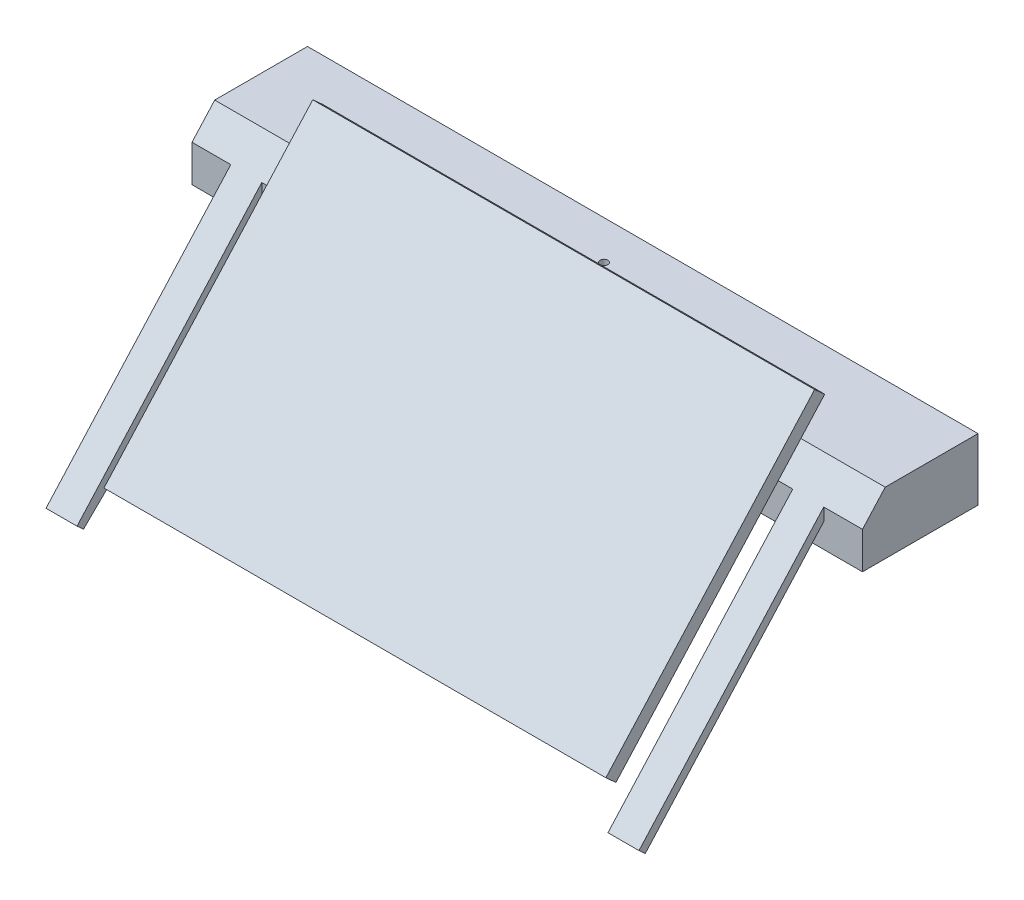
ISO-10303-21;
HEADER;
FILE_DESCRIPTION(('STEP AP214'),'2;1');
FILE_NAME('part.step','',(''),(''),'','','');
FILE_SCHEMA(('AUTOMOTIVE_DESIGN { 1 0 10303 214 1 1 1 1 }'));
ENDSEC;
DATA;
#1=APPLICATION_CONTEXT('core data for automotive mechanical design processes');
#2=APPLICATION_PROTOCOL_DEFINITION('international standard','automotive_design',2000,#1);
#3=PRODUCT_CONTEXT('',#1,'mechanical');
#4=PRODUCT('Part','Part','',(#3));
#5=PRODUCT_RELATED_PRODUCT_CATEGORY('part','',(#4));
#6=PRODUCT_DEFINITION_FORMATION('','',#4);
#7=PRODUCT_DEFINITION_CONTEXT('part definition',#1,'design');
#8=PRODUCT_DEFINITION('design','',#6,#7);
#9=PRODUCT_DEFINITION_SHAPE('','',#8);
#10=(LENGTH_UNIT() NAMED_UNIT(*) SI_UNIT(.MILLI.,.METRE.));
#11=(NAMED_UNIT(*) PLANE_ANGLE_UNIT() SI_UNIT($,.RADIAN.));
#12=(NAMED_UNIT(*) SI_UNIT($,.STERADIAN.) SOLID_ANGLE_UNIT());
#13=UNCERTAINTY_MEASURE_WITH_UNIT(LENGTH_MEASURE(1.E-05),#10,'distance_accuracy_value','');
#14=(GEOMETRIC_REPRESENTATION_CONTEXT(3) GLOBAL_UNCERTAINTY_ASSIGNED_CONTEXT((#13)) GLOBAL_UNIT_ASSIGNED_CONTEXT((#10,
#11,#12)) REPRESENTATION_CONTEXT('',''));
#15=CARTESIAN_POINT('',(0.,0.,0.));
#16=DIRECTION('',(0.,0.,1.));
#17=DIRECTION('',(1.,0.,0.));
#18=AXIS2_PLACEMENT_3D('',#15,#16,#17);
#19=CARTESIAN_POINT('',(64.75,-34.658042877744,51.4697949490209));
#20=DIRECTION('',(-1.,0.,0.));
#21=DIRECTION('',(0.,0.,1.));
#22=AXIS2_PLACEMENT_3D('',#19,#20,#21);
#23=PLANE('',#22);
#24=DIRECTION('',(0.,0.743144825477391,-0.669130606358862));
#25=VECTOR('',#24,1.);
#26=CARTESIAN_POINT('',(64.75,-37.,48.86878805985));
#27=LINE('',#26,#25);
#28=CARTESIAN_POINT('',(64.75,-37.,48.86878805985));
#29=VERTEX_POINT('',#28);
#30=CARTESIAN_POINT('',(64.75,22.82315845093,-4.99622575203842));
#31=VERTEX_POINT('',#30);
#32=EDGE_CURVE('E112',#29,#31,#27,.T.);
#33=ORIENTED_EDGE('',*,*,#32,.T.);
#34=DIRECTION('',(0.,-0.669130606358862,-0.743144825477391));
#35=VECTOR('',#34,1.);
#36=CARTESIAN_POINT('',(64.75,25.165115573186,-2.39521886286756));
#37=LINE('',#36,#35);
#38=CARTESIAN_POINT('',(64.75,25.165115573186,-2.39521886286756));
#39=VERTEX_POINT('',#38);
#40=EDGE_CURVE('E12',#39,#31,#37,.T.);
#41=ORIENTED_EDGE('',*,*,#40,.F.);
#42=DIRECTION('',(0.,0.743144825477391,-0.669130606358862));
#43=VECTOR('',#42,1.);
#44=CARTESIAN_POINT('',(64.75,-34.658042877744,51.4697949490209));
#45=LINE('',#44,#43);
#46=CARTESIAN_POINT('',(64.75,-34.658042877744,51.4697949490209));
#47=VERTEX_POINT('',#46);
#48=EDGE_CURVE('E100',#47,#39,#45,.T.);
#49=ORIENTED_EDGE('',*,*,#48,.F.);
#50=DIRECTION('',(0.,-0.669130606358862,-0.743144825477391));
#51=VECTOR('',#50,1.);
#52=CARTESIAN_POINT('',(64.75,-34.658042877744,51.4697949490209));
#53=LINE('',#52,#51);
#54=EDGE_CURVE('E108',#47,#29,#53,.T.);
#55=ORIENTED_EDGE('',*,*,#54,.T.);
#56=EDGE_LOOP('',(#33,#41,#49,#55));
#57=FACE_BOUND('',#56,.T.);
#58=ADVANCED_FACE('F49',(#57),#23,.F.);
#59=CARTESIAN_POINT('',(-64.75,25.165115573186,-2.39521886286756));
#60=DIRECTION('',(0.,-0.743144825477391,0.669130606358862));
#61=DIRECTION('',(0.,-0.669130606358862,-0.743144825477391));
#62=AXIS2_PLACEMENT_3D('',#59,#60,#61);
#63=PLANE('',#62);
#64=DIRECTION('',(-1.,0.,0.));
#65=VECTOR('',#64,1.);
#66=CARTESIAN_POINT('',(-64.75,22.82315845093,-4.99622575203842));
#67=LINE('',#66,#65);
#68=CARTESIAN_POINT('',(-64.75,22.82315845093,-4.99622575203842));
#69=VERTEX_POINT('',#68);
#70=EDGE_CURVE('E104',#31,#69,#67,.T.);
#71=ORIENTED_EDGE('',*,*,#70,.T.);
#72=DIRECTION('',(0.,-0.669130606358862,-0.743144825477391));
#73=VECTOR('',#72,1.);
#74=CARTESIAN_POINT('',(-64.75,25.165115573186,-2.39521886286756));
#75=LINE('',#74,#73);
#76=CARTESIAN_POINT('',(-64.75,25.165115573186,-2.39521886286756));
#77=VERTEX_POINT('',#76);
#78=EDGE_CURVE('E57',#77,#69,#75,.T.);
#79=ORIENTED_EDGE('',*,*,#78,.F.);
#80=DIRECTION('',(-1.,0.,0.));
#81=VECTOR('',#80,1.);
#82=CARTESIAN_POINT('',(-64.75,25.165115573186,-2.39521886286756));
#83=LINE('',#82,#81);
#84=EDGE_CURVE('E95',#39,#77,#83,.T.);
#85=ORIENTED_EDGE('',*,*,#84,.F.);
#86=ORIENTED_EDGE('',*,*,#40,.T.);
#87=EDGE_LOOP('',(#71,#79,#85,#86));
#88=FACE_BOUND('',#87,.T.);
#89=ADVANCED_FACE('F103',(#88),#63,.F.);
#90=CARTESIAN_POINT('',(-64.75,-34.658042877744,51.4697949490209));
#91=DIRECTION('',(1.,0.,0.));
#92=DIRECTION('',(0.,0.,-1.));
#93=AXIS2_PLACEMENT_3D('',#90,#91,#92);
#94=PLANE('',#93);
#95=DIRECTION('',(0.,-0.743144825477391,0.669130606358862));
#96=VECTOR('',#95,1.);
#97=CARTESIAN_POINT('',(-64.75,-37.,48.86878805985));
#98=LINE('',#97,#96);
#99=CARTESIAN_POINT('',(-64.75,-37.,48.86878805985));
#100=VERTEX_POINT('',#99);
#101=EDGE_CURVE('E82',#69,#100,#98,.T.);
#102=ORIENTED_EDGE('',*,*,#101,.T.);
#103=DIRECTION('',(0.,-0.669130606358862,-0.743144825477391));
#104=VECTOR('',#103,1.);
#105=CARTESIAN_POINT('',(-64.75,-34.658042877744,51.4697949490209));
#106=LINE('',#105,#104);
#107=CARTESIAN_POINT('',(-64.75,-34.658042877744,51.4697949490209));
#108=VERTEX_POINT('',#107);
#109=EDGE_CURVE('E105',#108,#100,#106,.T.);
#110=ORIENTED_EDGE('',*,*,#109,.F.);
#111=DIRECTION('',(0.,-0.743144825477391,0.669130606358862));
#112=VECTOR('',#111,1.);
#113=CARTESIAN_POINT('',(-64.75,-34.658042877744,51.4697949490209));
#114=LINE('',#113,#112);
#115=EDGE_CURVE('E98',#77,#108,#114,.T.);
#116=ORIENTED_EDGE('',*,*,#115,.F.);
#117=ORIENTED_EDGE('',*,*,#78,.T.);
#118=EDGE_LOOP('',(#102,#110,#116,#117));
#119=FACE_BOUND('',#118,.T.);
#120=ADVANCED_FACE('F106',(#119),#94,.F.);
#121=CARTESIAN_POINT('',(-64.75,-34.658042877744,51.4697949490209));
#122=DIRECTION('',(0.,0.743144825477391,-0.669130606358862));
#123=DIRECTION('',(0.,0.669130606358862,0.743144825477391));
#124=AXIS2_PLACEMENT_3D('',#121,#122,#123);
#125=PLANE('',#124);
#126=DIRECTION('',(1.,0.,0.));
#127=VECTOR('',#126,1.);
#128=CARTESIAN_POINT('',(-64.75,-37.,48.86878805985));
#129=LINE('',#128,#127);
#130=EDGE_CURVE('E88',#100,#29,#129,.T.);
#131=ORIENTED_EDGE('',*,*,#130,.T.);
#132=ORIENTED_EDGE('',*,*,#54,.F.);
#133=DIRECTION('',(1.,0.,0.));
#134=VECTOR('',#133,1.);
#135=CARTESIAN_POINT('',(-64.75,-34.658042877744,51.4697949490209));
#136=LINE('',#135,#134);
#137=EDGE_CURVE('E65',#108,#47,#136,.T.);
#138=ORIENTED_EDGE('',*,*,#137,.F.);
#139=ORIENTED_EDGE('',*,*,#109,.T.);
#140=EDGE_LOOP('',(#131,#132,#138,#139));
#141=FACE_BOUND('',#140,.T.);
#142=ADVANCED_FACE('F119',(#141),#125,.F.);
#143=CARTESIAN_POINT('',(0.,10.0762735555237,11.1908355136069));
#144=DIRECTION('',(0.,-0.669130606358862,-0.743144825477391));
#145=DIRECTION('',(0.,0.743144825477391,-0.669130606358862));
#146=AXIS2_PLACEMENT_3D('',#143,#144,#145);
#147=PLANE('',#146);
#148=ORIENTED_EDGE('',*,*,#48,.T.);
#149=ORIENTED_EDGE('',*,*,#84,.T.);
#150=ORIENTED_EDGE('',*,*,#115,.T.);
#151=ORIENTED_EDGE('',*,*,#137,.T.);
#152=EDGE_LOOP('',(#148,#149,#150,#151));
#153=FACE_BOUND('',#152,.T.);
#154=ADVANCED_FACE('F96',(#153),#147,.F.);
#155=CARTESIAN_POINT('',(0.,7.73431643326766,8.58982862443605));
#156=DIRECTION('',(0.,-0.669130606358862,-0.743144825477391));
#157=DIRECTION('',(0.,0.743144825477391,-0.669130606358862));
#158=AXIS2_PLACEMENT_3D('',#155,#156,#157);
#159=PLANE('',#158);
#160=ORIENTED_EDGE('',*,*,#32,.F.);
#161=ORIENTED_EDGE('',*,*,#130,.F.);
#162=ORIENTED_EDGE('',*,*,#101,.F.);
#163=ORIENTED_EDGE('',*,*,#70,.F.);
#164=EDGE_LOOP('',(#160,#161,#162,#163));
#165=FACE_BOUND('',#164,.T.);
#166=ADVANCED_FACE('F122',(#165),#159,.T.);
#167=CLOSED_SHELL('',(#58,#89,#120,#142,#154,#166));
#168=MANIFOLD_SOLID_BREP('B2_NOT_SHOWN',#167);
#169=CARTESIAN_POINT('',(81.5,14.,0.));
#170=CARTESIAN_POINT('',(74.436091258729,14.,-13.8819278627372));
#171=CARTESIAN_POINT('',(43.2593569608998,14.,-16.3621882759502));
#172=CARTESIAN_POINT('',(0.,14.,-18.5559275364417));
#173=CARTESIAN_POINT('',(-43.2593569608998,14.,-16.3621882759502));
#174=CARTESIAN_POINT('',(-74.436091258729,14.,-13.8819278627372));
#175=CARTESIAN_POINT('',(-81.5,14.,0.));
#176=B_SPLINE_CURVE_WITH_KNOTS('',3,(#169,#170,#171,#172,#173,#174,#175),.UNSPECIFIED.,.F.,.F.,
(4,1,1,1,4),(0.,0.237125687669127,0.5,0.762874312330873,1.),.UNSPECIFIED.);
#177=DIRECTION('',(0.,-1.,0.));
#178=VECTOR('',#177,1.);
#179=SURFACE_OF_LINEAR_EXTRUSION('',#176,#178);
#180=CARTESIAN_POINT('',(81.5,8.5,0.));
#181=CARTESIAN_POINT('',(74.436091258729,8.5,-13.8819278627372));
#182=CARTESIAN_POINT('',(43.2593569608998,8.5,-16.3621882759502));
#183=CARTESIAN_POINT('',(0.,8.5,-18.5559275364417));
#184=CARTESIAN_POINT('',(-43.2593569608998,8.5,-16.3621882759502));
#185=CARTESIAN_POINT('',(-74.436091258729,8.5,-13.8819278627372));
#186=CARTESIAN_POINT('',(-81.5,8.5,0.));
#187=B_SPLINE_CURVE_WITH_KNOTS('',3,(#180,#181,#182,#183,#184,#185,#186),.UNSPECIFIED.,.F.,.F.,
(4,1,1,1,4),(0.,0.237125687669127,0.5,0.762874312330873,1.),.UNSPECIFIED.);
#188=CARTESIAN_POINT('',(-7.93134864124332,8.5,-17.7313486412434));
#189=VERTEX_POINT('',#188);
#190=CARTESIAN_POINT('',(7.93134864124332,8.5,-17.7313486412434));
#191=VERTEX_POINT('',#190);
#192=EDGE_CURVE('E447',#189,#191,#187,.F.);
#193=ORIENTED_EDGE('',*,*,#192,.F.);
#194=DIRECTION('',(0.,1.,0.));
#195=VECTOR('',#194,1.);
#196=CARTESIAN_POINT('',(-7.93134864124332,8.5,-17.7313486412434));
#197=LINE('',#196,#195);
#198=CARTESIAN_POINT('',(-7.93134864124332,14.,-17.7313486412434));
#199=VERTEX_POINT('',#198);
#200=EDGE_CURVE('E379',#189,#199,#197,.T.);
#201=ORIENTED_EDGE('',*,*,#200,.T.);
#202=CARTESIAN_POINT('',(-81.5,14.,0.));
#203=VERTEX_POINT('',#202);
#204=EDGE_CURVE('E404',#199,#203,#176,.T.);
#205=ORIENTED_EDGE('',*,*,#204,.T.);
#206=DIRECTION('',(0.,-1.,0.));
#207=VECTOR('',#206,1.);
#208=CARTESIAN_POINT('',(-81.5,14.,0.));
#209=LINE('',#208,#207);
#210=CARTESIAN_POINT('',(-81.5,0.,0.));
#211=VERTEX_POINT('',#210);
#212=EDGE_CURVE('E490',#203,#211,#209,.T.);
#213=ORIENTED_EDGE('',*,*,#212,.T.);
#214=CARTESIAN_POINT('',(81.5,0.,0.));
#215=CARTESIAN_POINT('',(74.436091258729,0.,-13.8819278627372));
#216=CARTESIAN_POINT('',(43.2593569608998,0.,-16.3621882759502));
#217=CARTESIAN_POINT('',(0.,0.,-18.5559275364417));
#218=CARTESIAN_POINT('',(-43.2593569608998,0.,-16.3621882759502));
#219=CARTESIAN_POINT('',(-74.436091258729,0.,-13.8819278627372));
#220=CARTESIAN_POINT('',(-81.5,0.,0.));
#221=B_SPLINE_CURVE_WITH_KNOTS('',3,(#214,#215,#216,#217,#218,#219,#220),.UNSPECIFIED.,.F.,.F.,
(4,1,1,1,4),(0.,0.237125687669127,0.5,0.762874312330873,1.),.UNSPECIFIED.);
#222=CARTESIAN_POINT('',(81.5,0.,0.));
#223=VERTEX_POINT('',#222);
#224=EDGE_CURVE('E396',#223,#211,#221,.T.);
#225=ORIENTED_EDGE('',*,*,#224,.F.);
#226=DIRECTION('',(0.,-1.,0.));
#227=VECTOR('',#226,1.);
#228=CARTESIAN_POINT('',(81.5,14.,0.));
#229=LINE('',#228,#227);
#230=CARTESIAN_POINT('',(81.5,14.,0.));
#231=VERTEX_POINT('',#230);
#232=EDGE_CURVE('E495',#231,#223,#229,.T.);
#233=ORIENTED_EDGE('',*,*,#232,.F.);
#234=CARTESIAN_POINT('',(7.93134864124332,14.,-17.7313486412434));
#235=VERTEX_POINT('',#234);
#236=EDGE_CURVE('E397',#231,#235,#176,.T.);
#237=ORIENTED_EDGE('',*,*,#236,.T.);
#238=DIRECTION('',(0.,1.,0.));
#239=VECTOR('',#238,1.);
#240=CARTESIAN_POINT('',(7.93134864124332,8.5,-17.7313486412434));
#241=LINE('',#240,#239);
#242=EDGE_CURVE('E375',#191,#235,#241,.T.);
#243=ORIENTED_EDGE('',*,*,#242,.F.);
#244=EDGE_LOOP('',(#193,#201,#205,#213,#225,#233,#237,#243));
#245=FACE_BOUND('',#244,.T.);
#246=ADVANCED_FACE('F173',(#245),#179,.T.);
#247=CARTESIAN_POINT('',(0.,14.,0.));
#248=DIRECTION('',(0.,-1.,0.));
#249=DIRECTION('',(0.,0.,-1.));
#250=AXIS2_PLACEMENT_3D('',#247,#248,#249);
#251=PLANE('',#250);
#252=DIRECTION('',(-0.707106781186546,0.,-0.707106781186549));
#253=VECTOR('',#252,1.);
#254=CARTESIAN_POINT('',(0.,14.,-9.8));
#255=LINE('',#254,#253);
#256=CARTESIAN_POINT('',(0.,14.,-9.8));
#257=VERTEX_POINT('',#256);
#258=EDGE_CURVE('E373',#257,#199,#255,.T.);
#259=ORIENTED_EDGE('',*,*,#258,.F.);
#260=DIRECTION('',(-0.707106781186546,0.,0.707106781186549));
#261=VECTOR('',#260,1.);
#262=CARTESIAN_POINT('',(7.93134864124332,14.,-17.7313486412434));
#263=LINE('',#262,#261);
#264=EDGE_CURVE('E368',#235,#257,#263,.T.);
#265=ORIENTED_EDGE('',*,*,#264,.F.);
#266=ORIENTED_EDGE('',*,*,#236,.F.);
#267=DIRECTION('',(1.,0.,0.));
#268=VECTOR('',#267,1.);
#269=CARTESIAN_POINT('',(-81.5,14.,0.));
#270=LINE('',#269,#268);
#271=EDGE_CURVE('E403',#203,#231,#270,.T.);
#272=ORIENTED_EDGE('',*,*,#271,.F.);
#273=ORIENTED_EDGE('',*,*,#204,.F.);
#274=EDGE_LOOP('',(#259,#265,#266,#272,#273));
#275=FACE_BOUND('',#274,.T.);
#276=ADVANCED_FACE('F413',(#275),#251,.T.);
#277=CARTESIAN_POINT('',(0.,0.,0.));
#278=DIRECTION('',(0.,1.,0.));
#279=DIRECTION('',(0.,0.,1.));
#280=AXIS2_PLACEMENT_3D('',#277,#278,#279);
#281=PLANE('',#280);
#282=DIRECTION('',(0.,0.,1.));
#283=VECTOR('',#282,1.);
#284=CARTESIAN_POINT('',(-86.5,0.,-22.8));
#285=LINE('',#284,#283);
#286=CARTESIAN_POINT('',(-86.5,0.,-22.8));
#287=VERTEX_POINT('',#286);
#288=CARTESIAN_POINT('',(-86.5,0.,7.));
#289=VERTEX_POINT('',#288);
#290=EDGE_CURVE('E444',#287,#289,#285,.T.);
#291=ORIENTED_EDGE('',*,*,#290,.F.);
#292=DIRECTION('',(-1.,0.,0.));
#293=VECTOR('',#292,1.);
#294=CARTESIAN_POINT('',(86.5,0.,-22.8));
#295=LINE('',#294,#293);
#296=CARTESIAN_POINT('',(86.5,0.,-22.8));
#297=VERTEX_POINT('',#296);
#298=EDGE_CURVE('E484',#297,#287,#295,.T.);
#299=ORIENTED_EDGE('',*,*,#298,.F.);
#300=DIRECTION('',(0.,0.,-1.));
#301=VECTOR('',#300,1.);
#302=CARTESIAN_POINT('',(86.5,0.,7.));
#303=LINE('',#302,#301);
#304=CARTESIAN_POINT('',(86.5,0.,7.));
#305=VERTEX_POINT('',#304);
#306=EDGE_CURVE('E492',#305,#297,#303,.T.);
#307=ORIENTED_EDGE('',*,*,#306,.F.);
#308=DIRECTION('',(1.,0.,0.));
#309=VECTOR('',#308,1.);
#310=CARTESIAN_POINT('',(-86.5,0.,7.));
#311=LINE('',#310,#309);
#312=EDGE_CURVE('E489',#289,#305,#311,.T.);
#313=ORIENTED_EDGE('',*,*,#312,.F.);
#314=EDGE_LOOP('',(#291,#299,#307,#313));
#315=FACE_BOUND('',#314,.T.);
#316=ORIENTED_EDGE('',*,*,#224,.T.);
#317=DIRECTION('',(1.,0.,0.));
#318=VECTOR('',#317,1.);
#319=CARTESIAN_POINT('',(-81.5,0.,0.));
#320=LINE('',#319,#318);
#321=EDGE_CURVE('E566',#211,#223,#320,.T.);
#322=ORIENTED_EDGE('',*,*,#321,.T.);
#323=EDGE_LOOP('',(#316,#322));
#324=FACE_BOUND('',#323,.T.);
#325=ADVANCED_FACE('F417',(#315,#324),#281,.F.);
#326=CARTESIAN_POINT('',(-86.5,14.,-22.8));
#327=DIRECTION('',(1.,0.,0.));
#328=DIRECTION('',(0.,0.,-1.));
#329=AXIS2_PLACEMENT_3D('',#326,#327,#328);
#330=PLANE('',#329);
#331=DIRECTION('',(0.,-1.,0.));
#332=VECTOR('',#331,1.);
#333=CARTESIAN_POINT('',(-86.5,14.,7.));
#334=LINE('',#333,#332);
#335=CARTESIAN_POINT('',(-86.5,9.50000000000002,6.99999999999999));
#336=VERTEX_POINT('',#335);
#337=EDGE_CURVE('E439',#336,#289,#334,.T.);
#338=ORIENTED_EDGE('',*,*,#337,.F.);
#339=DIRECTION('',(0.,0.743144825477391,-0.669130606358862));
#340=VECTOR('',#339,1.);
#341=CARTESIAN_POINT('',(-86.5,-37.,48.86878805985));
#342=LINE('',#341,#340);
#343=CARTESIAN_POINT('',(-86.5,16.,1.14737371206397));
#344=VERTEX_POINT('',#343);
#345=EDGE_CURVE('E358',#336,#344,#342,.T.);
#346=ORIENTED_EDGE('',*,*,#345,.T.);
#347=DIRECTION('',(0.,0.,1.));
#348=VECTOR('',#347,1.);
#349=CARTESIAN_POINT('',(-86.5,16.,7.));
#350=LINE('',#349,#348);
#351=CARTESIAN_POINT('',(-86.5,16.,-22.8));
#352=VERTEX_POINT('',#351);
#353=EDGE_CURVE('E388',#352,#344,#350,.T.);
#354=ORIENTED_EDGE('',*,*,#353,.F.);
#355=DIRECTION('',(0.,-1.,0.));
#356=VECTOR('',#355,1.);
#357=CARTESIAN_POINT('',(-86.5,14.,-22.8));
#358=LINE('',#357,#356);
#359=EDGE_CURVE('E483',#352,#287,#358,.T.);
#360=ORIENTED_EDGE('',*,*,#359,.T.);
#361=ORIENTED_EDGE('',*,*,#290,.T.);
#362=EDGE_LOOP('',(#338,#346,#354,#360,#361));
#363=FACE_BOUND('',#362,.T.);
#364=ADVANCED_FACE('F420',(#363),#330,.F.);
#365=CARTESIAN_POINT('',(-86.5,14.,7.));
#366=DIRECTION('',(0.,0.,-1.));
#367=DIRECTION('',(-1.,0.,0.));
#368=AXIS2_PLACEMENT_3D('',#365,#366,#367);
#369=PLANE('',#368);
#370=DIRECTION('',(0.,-1.,0.));
#371=VECTOR('',#370,1.);
#372=CARTESIAN_POINT('',(-68.5,14.,7.));
#373=LINE('',#372,#371);
#374=CARTESIAN_POINT('',(-68.5,9.49999999999999,7.));
#375=VERTEX_POINT('',#374);
#376=CARTESIAN_POINT('',(-68.5,0.225712396194971,7.));
#377=VERTEX_POINT('',#376);
#378=EDGE_CURVE('E353',#375,#377,#373,.T.);
#379=ORIENTED_EDGE('',*,*,#378,.T.);
#380=DIRECTION('',(-1.,0.,0.));
#381=VECTOR('',#380,1.);
#382=CARTESIAN_POINT('',(-76.5,0.225712396194971,7.));
#383=LINE('',#382,#381);
#384=CARTESIAN_POINT('',(-76.5,0.22571239619497,7.));
#385=VERTEX_POINT('',#384);
#386=EDGE_CURVE('E462',#377,#385,#383,.T.);
#387=ORIENTED_EDGE('',*,*,#386,.T.);
#388=DIRECTION('',(0.,1.,0.));
#389=VECTOR('',#388,1.);
#390=CARTESIAN_POINT('',(-76.5,14.,7.));
#391=LINE('',#390,#389);
#392=CARTESIAN_POINT('',(-76.5,9.49999999999997,7.00000000000002));
#393=VERTEX_POINT('',#392);
#394=EDGE_CURVE('E349',#385,#393,#391,.T.);
#395=ORIENTED_EDGE('',*,*,#394,.T.);
#396=DIRECTION('',(-1.,0.,0.));
#397=VECTOR('',#396,1.);
#398=CARTESIAN_POINT('',(-86.5,9.49999999999999,7.));
#399=LINE('',#398,#397);
#400=EDGE_CURVE('E361',#393,#336,#399,.T.);
#401=ORIENTED_EDGE('',*,*,#400,.T.);
#402=ORIENTED_EDGE('',*,*,#337,.T.);
#403=ORIENTED_EDGE('',*,*,#312,.T.);
#404=DIRECTION('',(0.,-1.,0.));
#405=VECTOR('',#404,1.);
#406=CARTESIAN_POINT('',(86.5,14.,7.));
#407=LINE('',#406,#405);
#408=CARTESIAN_POINT('',(86.5,9.49999999999997,7.00000000000002));
#409=VERTEX_POINT('',#408);
#410=EDGE_CURVE('E448',#409,#305,#407,.T.);
#411=ORIENTED_EDGE('',*,*,#410,.F.);
#412=CARTESIAN_POINT('',(76.5,9.49999999999999,7.));
#413=VERTEX_POINT('',#412);
#414=EDGE_CURVE('E362',#409,#413,#399,.T.);
#415=ORIENTED_EDGE('',*,*,#414,.T.);
#416=DIRECTION('',(0.,-1.,0.));
#417=VECTOR('',#416,1.);
#418=CARTESIAN_POINT('',(76.5,14.,7.));
#419=LINE('',#418,#417);
#420=CARTESIAN_POINT('',(76.5,6.22571239619571,7.));
#421=VERTEX_POINT('',#420);
#422=EDGE_CURVE('E334',#413,#421,#419,.T.);
#423=ORIENTED_EDGE('',*,*,#422,.T.);
#424=DIRECTION('',(-1.,0.,0.));
#425=VECTOR('',#424,1.);
#426=CARTESIAN_POINT('',(-86.5,6.22571239619571,7.));
#427=LINE('',#426,#425);
#428=CARTESIAN_POINT('',(68.5,6.22571239619571,7.));
#429=VERTEX_POINT('',#428);
#430=EDGE_CURVE('E338',#421,#429,#427,.T.);
#431=ORIENTED_EDGE('',*,*,#430,.T.);
#432=DIRECTION('',(0.,1.,0.));
#433=VECTOR('',#432,1.);
#434=CARTESIAN_POINT('',(68.5,14.,7.));
#435=LINE('',#434,#433);
#436=CARTESIAN_POINT('',(68.5,9.49999999999998,7.00000000000001));
#437=VERTEX_POINT('',#436);
#438=EDGE_CURVE('E308',#429,#437,#435,.T.);
#439=ORIENTED_EDGE('',*,*,#438,.T.);
#440=EDGE_CURVE('E365',#437,#375,#399,.T.);
#441=ORIENTED_EDGE('',*,*,#440,.T.);
#442=EDGE_LOOP('',(#379,#387,#395,#401,#402,#403,#411,#415,#423,#431,#439,#441));
#443=FACE_BOUND('',#442,.T.);
#444=ADVANCED_FACE('F429',(#443),#369,.F.);
#445=CARTESIAN_POINT('',(86.5,14.,7.));
#446=DIRECTION('',(-1.,0.,0.));
#447=DIRECTION('',(0.,0.,1.));
#448=AXIS2_PLACEMENT_3D('',#445,#446,#447);
#449=PLANE('',#448);
#450=DIRECTION('',(0.,0.,-1.));
#451=VECTOR('',#450,1.);
#452=CARTESIAN_POINT('',(86.5,16.,-22.8));
#453=LINE('',#452,#451);
#454=CARTESIAN_POINT('',(86.5,16.,1.14737371206397));
#455=VERTEX_POINT('',#454);
#456=CARTESIAN_POINT('',(86.5,16.,-22.8));
#457=VERTEX_POINT('',#456);
#458=EDGE_CURVE('E391',#455,#457,#453,.T.);
#459=ORIENTED_EDGE('',*,*,#458,.F.);
#460=DIRECTION('',(0.,0.743144825477391,-0.669130606358862));
#461=VECTOR('',#460,1.);
#462=CARTESIAN_POINT('',(86.5,-37.,48.86878805985));
#463=LINE('',#462,#461);
#464=EDGE_CURVE('E355',#409,#455,#463,.T.);
#465=ORIENTED_EDGE('',*,*,#464,.F.);
#466=ORIENTED_EDGE('',*,*,#410,.T.);
#467=ORIENTED_EDGE('',*,*,#306,.T.);
#468=DIRECTION('',(0.,-1.,0.));
#469=VECTOR('',#468,1.);
#470=CARTESIAN_POINT('',(86.5,14.,-22.8));
#471=LINE('',#470,#469);
#472=EDGE_CURVE('E452',#457,#297,#471,.T.);
#473=ORIENTED_EDGE('',*,*,#472,.F.);
#474=EDGE_LOOP('',(#459,#465,#466,#467,#473));
#475=FACE_BOUND('',#474,.T.);
#476=ADVANCED_FACE('F425',(#475),#449,.F.);
#477=CARTESIAN_POINT('',(86.5,14.,-22.8));
#478=DIRECTION('',(0.,0.,1.));
#479=DIRECTION('',(1.,0.,0.));
#480=AXIS2_PLACEMENT_3D('',#477,#478,#479);
#481=PLANE('',#480);
#482=ORIENTED_EDGE('',*,*,#298,.T.);
#483=ORIENTED_EDGE('',*,*,#359,.F.);
#484=DIRECTION('',(-1.,0.,0.));
#485=VECTOR('',#484,1.);
#486=CARTESIAN_POINT('',(-86.5,16.,-22.8));
#487=LINE('',#486,#485);
#488=EDGE_CURVE('E393',#457,#352,#487,.T.);
#489=ORIENTED_EDGE('',*,*,#488,.F.);
#490=ORIENTED_EDGE('',*,*,#472,.T.);
#491=EDGE_LOOP('',(#482,#483,#489,#490));
#492=FACE_BOUND('',#491,.T.);
#493=ADVANCED_FACE('F422',(#492),#481,.F.);
#494=CARTESIAN_POINT('',(-81.5,14.,0.));
#495=DIRECTION('',(0.,0.,-1.));
#496=DIRECTION('',(-1.,0.,0.));
#497=AXIS2_PLACEMENT_3D('',#494,#495,#496);
#498=PLANE('',#497);
#499=ORIENTED_EDGE('',*,*,#321,.F.);
#500=ORIENTED_EDGE('',*,*,#212,.F.);
#501=ORIENTED_EDGE('',*,*,#271,.T.);
#502=ORIENTED_EDGE('',*,*,#232,.T.);
#503=EDGE_LOOP('',(#499,#500,#501,#502));
#504=FACE_BOUND('',#503,.T.);
#505=ADVANCED_FACE('F415',(#504),#498,.T.);
#506=CARTESIAN_POINT('',(0.,16.,0.));
#507=DIRECTION('',(0.,-1.,0.));
#508=DIRECTION('',(0.,0.,-1.));
#509=AXIS2_PLACEMENT_3D('',#506,#507,#508);
#510=PLANE('',#509);
#511=ORIENTED_EDGE('',*,*,#353,.T.);
#512=DIRECTION('',(1.,0.,0.));
#513=VECTOR('',#512,1.);
#514=CARTESIAN_POINT('',(0.,16.,1.14737371206398));
#515=LINE('',#514,#513);
#516=EDGE_CURVE('E450',#344,#455,#515,.T.);
#517=ORIENTED_EDGE('',*,*,#516,.T.);
#518=ORIENTED_EDGE('',*,*,#458,.T.);
#519=ORIENTED_EDGE('',*,*,#488,.T.);
#520=EDGE_LOOP('',(#511,#517,#518,#519));
#521=FACE_BOUND('',#520,.T.);
#522=CARTESIAN_POINT('',(0.,16.,-12.8));
#523=DIRECTION('',(0.,1.,0.));
#524=DIRECTION('',(0.,0.,1.));
#525=AXIS2_PLACEMENT_3D('',#522,#523,#524);
#526=CIRCLE('',#525,0.999999999999999);
#527=CARTESIAN_POINT('',(0.,16.,-11.8));
#528=VERTEX_POINT('',#527);
#529=EDGE_CURVE('E385',#528,#528,#526,.T.);
#530=ORIENTED_EDGE('',*,*,#529,.F.);
#531=EDGE_LOOP('',(#530));
#532=FACE_BOUND('',#531,.T.);
#533=ADVANCED_FACE('F479',(#521,#532),#510,.F.);
#534=CARTESIAN_POINT('',(0.,16.,-12.8));
#535=DIRECTION('',(0.,-1.,0.));
#536=DIRECTION('',(0.,0.,-1.));
#537=AXIS2_PLACEMENT_3D('',#534,#535,#536);
#538=CYLINDRICAL_SURFACE('',#537,0.999999999999999);
#539=ORIENTED_EDGE('',*,*,#529,.T.);
#540=EDGE_LOOP('',(#539));
#541=FACE_BOUND('',#540,.T.);
#542=CARTESIAN_POINT('',(0.,8.5,-12.8));
#543=DIRECTION('',(0.,-1.,0.));
#544=DIRECTION('',(0.,0.,-1.));
#545=AXIS2_PLACEMENT_3D('',#542,#543,#544);
#546=CIRCLE('',#545,0.999999999999999);
#547=CARTESIAN_POINT('',(0.,8.5,-13.8));
#548=VERTEX_POINT('',#547);
#549=EDGE_CURVE('E364',#548,#548,#546,.T.);
#550=ORIENTED_EDGE('',*,*,#549,.T.);
#551=EDGE_LOOP('',(#550));
#552=FACE_BOUND('',#551,.T.);
#553=ADVANCED_FACE('F532',(#541,#552),#538,.F.);
#554=CARTESIAN_POINT('',(0.,8.5,0.));
#555=DIRECTION('',(0.,-1.,0.));
#556=DIRECTION('',(0.,0.,-1.));
#557=AXIS2_PLACEMENT_3D('',#554,#555,#556);
#558=PLANE('',#557);
#559=DIRECTION('',(-0.707106781186546,0.,-0.707106781186549));
#560=VECTOR('',#559,1.);
#561=CARTESIAN_POINT('',(0.,8.5,-9.8));
#562=LINE('',#561,#560);
#563=CARTESIAN_POINT('',(0.,8.5,-9.8));
#564=VERTEX_POINT('',#563);
#565=EDGE_CURVE('E372',#564,#189,#562,.T.);
#566=ORIENTED_EDGE('',*,*,#565,.T.);
#567=ORIENTED_EDGE('',*,*,#192,.T.);
#568=DIRECTION('',(-0.707106781186546,0.,0.707106781186549));
#569=VECTOR('',#568,1.);
#570=CARTESIAN_POINT('',(7.93134864124332,8.5,-17.7313486412434));
#571=LINE('',#570,#569);
#572=EDGE_CURVE('E369',#191,#564,#571,.T.);
#573=ORIENTED_EDGE('',*,*,#572,.T.);
#574=EDGE_LOOP('',(#566,#567,#573));
#575=FACE_BOUND('',#574,.T.);
#576=ORIENTED_EDGE('',*,*,#549,.F.);
#577=EDGE_LOOP('',(#576));
#578=FACE_BOUND('',#577,.T.);
#579=ADVANCED_FACE('F528',(#575,#578),#558,.T.);
#580=CARTESIAN_POINT('',(7.93134864124332,8.5,-17.7313486412434));
#581=DIRECTION('',(-0.707106781186549,0.,-0.707106781186546));
#582=DIRECTION('',(-0.707106781186546,0.,0.707106781186549));
#583=AXIS2_PLACEMENT_3D('',#580,#581,#582);
#584=PLANE('',#583);
#585=ORIENTED_EDGE('',*,*,#264,.T.);
#586=DIRECTION('',(0.,1.,0.));
#587=VECTOR('',#586,1.);
#588=CARTESIAN_POINT('',(0.,8.5,-9.8));
#589=LINE('',#588,#587);
#590=EDGE_CURVE('E382',#564,#257,#589,.T.);
#591=ORIENTED_EDGE('',*,*,#590,.F.);
#592=ORIENTED_EDGE('',*,*,#572,.F.);
#593=ORIENTED_EDGE('',*,*,#242,.T.);
#594=EDGE_LOOP('',(#585,#591,#592,#593));
#595=FACE_BOUND('',#594,.T.);
#596=ADVANCED_FACE('F531',(#595),#584,.F.);
#597=CARTESIAN_POINT('',(0.,8.5,-9.8));
#598=DIRECTION('',(0.707106781186549,0.,-0.707106781186546));
#599=DIRECTION('',(-0.707106781186546,0.,-0.707106781186549));
#600=AXIS2_PLACEMENT_3D('',#597,#598,#599);
#601=PLANE('',#600);
#602=ORIENTED_EDGE('',*,*,#258,.T.);
#603=ORIENTED_EDGE('',*,*,#200,.F.);
#604=ORIENTED_EDGE('',*,*,#565,.F.);
#605=ORIENTED_EDGE('',*,*,#590,.T.);
#606=EDGE_LOOP('',(#602,#603,#604,#605));
#607=FACE_BOUND('',#606,.T.);
#608=ADVANCED_FACE('F527',(#607),#601,.F.);
#609=CARTESIAN_POINT('',(-86.5,-37.,48.86878805985));
#610=DIRECTION('',(0.,-0.669130606358862,-0.743144825477391));
#611=DIRECTION('',(0.,0.743144825477391,-0.669130606358862));
#612=AXIS2_PLACEMENT_3D('',#609,#610,#611);
#613=PLANE('',#612);
#614=ORIENTED_EDGE('',*,*,#464,.T.);
#615=ORIENTED_EDGE('',*,*,#516,.F.);
#616=ORIENTED_EDGE('',*,*,#345,.F.);
#617=ORIENTED_EDGE('',*,*,#400,.F.);
#618=DIRECTION('',(0.,-0.743144825477391,0.669130606358862));
#619=VECTOR('',#618,1.);
#620=CARTESIAN_POINT('',(-76.5,16.,1.14737371206397));
#621=LINE('',#620,#619);
#622=CARTESIAN_POINT('',(-76.5,-43.4515860381913,54.6778222207729));
#623=VERTEX_POINT('',#622);
#624=EDGE_CURVE('E340',#393,#623,#621,.T.);
#625=ORIENTED_EDGE('',*,*,#624,.T.);
#626=DIRECTION('',(1.,0.,0.));
#627=VECTOR('',#626,1.);
#628=CARTESIAN_POINT('',(-76.5,-43.4515860381913,54.6778222207729));
#629=LINE('',#628,#627);
#630=CARTESIAN_POINT('',(-68.5,-43.4515860381913,54.6778222207729));
#631=VERTEX_POINT('',#630);
#632=EDGE_CURVE('E342',#623,#631,#629,.T.);
#633=ORIENTED_EDGE('',*,*,#632,.T.);
#634=DIRECTION('',(0.,0.743144825477391,-0.669130606358862));
#635=VECTOR('',#634,1.);
#636=CARTESIAN_POINT('',(-68.5,-43.4515860381913,54.6778222207729));
#637=LINE('',#636,#635);
#638=EDGE_CURVE('E345',#631,#375,#637,.T.);
#639=ORIENTED_EDGE('',*,*,#638,.T.);
#640=ORIENTED_EDGE('',*,*,#440,.F.);
#641=DIRECTION('',(0.,-0.743144825477391,0.669130606358862));
#642=VECTOR('',#641,1.);
#643=CARTESIAN_POINT('',(68.5,-43.4515860381912,54.6778222207729));
#644=LINE('',#643,#642);
#645=CARTESIAN_POINT('',(68.5,-43.4515860381912,54.6778222207729));
#646=VERTEX_POINT('',#645);
#647=EDGE_CURVE('E329',#437,#646,#644,.T.);
#648=ORIENTED_EDGE('',*,*,#647,.T.);
#649=DIRECTION('',(1.,0.,0.));
#650=VECTOR('',#649,1.);
#651=CARTESIAN_POINT('',(76.5,-43.4515860381912,54.6778222207729));
#652=LINE('',#651,#650);
#653=CARTESIAN_POINT('',(76.5,-43.4515860381912,54.6778222207729));
#654=VERTEX_POINT('',#653);
#655=EDGE_CURVE('E319',#646,#654,#652,.T.);
#656=ORIENTED_EDGE('',*,*,#655,.T.);
#657=DIRECTION('',(0.,0.743144825477391,-0.669130606358862));
#658=VECTOR('',#657,1.);
#659=CARTESIAN_POINT('',(76.5,16.,1.14737371206396));
#660=LINE('',#659,#658);
#661=EDGE_CURVE('E313',#654,#413,#660,.T.);
#662=ORIENTED_EDGE('',*,*,#661,.T.);
#663=ORIENTED_EDGE('',*,*,#414,.F.);
#664=EDGE_LOOP('',(#614,#615,#616,#617,#625,#633,#639,#640,#648,#656,#662,#663));
#665=FACE_BOUND('',#664,.T.);
#666=ADVANCED_FACE('F475',(#665),#613,.F.);
#667=CARTESIAN_POINT('',(-68.5,-44.9176017143324,53.0496468639148));
#668=DIRECTION('',(1.,0.,0.));
#669=DIRECTION('',(0.,0.,-1.));
#670=AXIS2_PLACEMENT_3D('',#667,#668,#669);
#671=PLANE('',#670);
#672=ORIENTED_EDGE('',*,*,#378,.F.);
#673=ORIENTED_EDGE('',*,*,#638,.F.);
#674=DIRECTION('',(0.,0.669130606358862,0.743144825477391));
#675=VECTOR('',#674,1.);
#676=CARTESIAN_POINT('',(-68.5,-44.9176017143324,53.0496468639148));
#677=LINE('',#676,#675);
#678=CARTESIAN_POINT('',(-68.5,-44.9659630088536,52.9959362049863));
#679=VERTEX_POINT('',#678);
#680=EDGE_CURVE('E196',#679,#631,#677,.T.);
#681=ORIENTED_EDGE('',*,*,#680,.F.);
#682=DIRECTION('',(0.,-0.700842948777298,0.713315611177228));
#683=VECTOR('',#682,1.);
#684=CARTESIAN_POINT('',(-68.5,-45.7944253872217,53.8391424451204));
#685=LINE('',#684,#683);
#686=EDGE_CURVE('E182',#679,#377,#685,.F.);
#687=ORIENTED_EDGE('',*,*,#686,.T.);
#688=EDGE_LOOP('',(#672,#673,#681,#687));
#689=FACE_BOUND('',#688,.T.);
#690=ADVANCED_FACE('F469',(#689),#671,.T.);
#691=CARTESIAN_POINT('',(-76.5,14.5339843238588,-0.480801644794168));
#692=DIRECTION('',(-1.,0.,0.));
#693=DIRECTION('',(0.,-1.,0.));
#694=AXIS2_PLACEMENT_3D('',#691,#692,#693);
#695=PLANE('',#694);
#696=ORIENTED_EDGE('',*,*,#394,.F.);
#697=DIRECTION('',(0.,0.700842948777298,-0.713315611177228));
#698=VECTOR('',#697,1.);
#699=CARTESIAN_POINT('',(-76.5,-45.7944253872217,53.8391424451204));
#700=LINE('',#699,#698);
#701=CARTESIAN_POINT('',(-76.5,-44.9659630088536,52.9959362049863));
#702=VERTEX_POINT('',#701);
#703=EDGE_CURVE('E47',#385,#702,#700,.F.);
#704=ORIENTED_EDGE('',*,*,#703,.T.);
#705=DIRECTION('',(0.,0.669130606358862,0.743144825477391));
#706=VECTOR('',#705,1.);
#707=CARTESIAN_POINT('',(-76.5,-44.9176017143324,53.0496468639148));
#708=LINE('',#707,#706);
#709=EDGE_CURVE('E189',#702,#623,#708,.T.);
#710=ORIENTED_EDGE('',*,*,#709,.T.);
#711=ORIENTED_EDGE('',*,*,#624,.F.);
#712=EDGE_LOOP('',(#696,#704,#710,#711));
#713=FACE_BOUND('',#712,.T.);
#714=ADVANCED_FACE('F518',(#713),#695,.T.);
#715=CARTESIAN_POINT('',(-76.5,-44.9176017143324,53.0496468639148));
#716=DIRECTION('',(0.,-0.743144825477391,0.669130606358862));
#717=DIRECTION('',(0.,-0.669130606358862,-0.743144825477391));
#718=AXIS2_PLACEMENT_3D('',#715,#716,#717);
#719=PLANE('',#718);
#720=ORIENTED_EDGE('',*,*,#632,.F.);
#721=ORIENTED_EDGE('',*,*,#709,.F.);
#722=DIRECTION('',(-1.,0.,0.));
#723=VECTOR('',#722,1.);
#724=CARTESIAN_POINT('',(0.,-44.9659630088536,52.9959362049863));
#725=LINE('',#724,#723);
#726=EDGE_CURVE('E465',#702,#679,#725,.F.);
#727=ORIENTED_EDGE('',*,*,#726,.T.);
#728=ORIENTED_EDGE('',*,*,#680,.T.);
#729=EDGE_LOOP('',(#720,#721,#727,#728));
#730=FACE_BOUND('',#729,.T.);
#731=ADVANCED_FACE('F519',(#730),#719,.T.);
#732=CARTESIAN_POINT('',(0.,6.26830075712649,6.96165326757791));
#733=DIRECTION('',(0.,-0.669130606358862,-0.743144825477391));
#734=DIRECTION('',(0.,0.743144825477391,-0.669130606358862));
#735=AXIS2_PLACEMENT_3D('',#732,#733,#734);
#736=PLANE('',#735);
#737=ORIENTED_EDGE('',*,*,#430,.F.);
#738=DIRECTION('',(0.,0.743144825477391,-0.669130606358862));
#739=VECTOR('',#738,1.);
#740=CARTESIAN_POINT('',(76.5,14.5339843238589,-0.480801644794178));
#741=LINE('',#740,#739);
#742=CARTESIAN_POINT('',(76.5,-44.9176017143324,53.0496468639148));
#743=VERTEX_POINT('',#742);
#744=EDGE_CURVE('E321',#743,#421,#741,.T.);
#745=ORIENTED_EDGE('',*,*,#744,.F.);
#746=DIRECTION('',(1.,0.,0.));
#747=VECTOR('',#746,1.);
#748=CARTESIAN_POINT('',(76.5,-44.9176017143324,53.0496468639148));
#749=LINE('',#748,#747);
#750=CARTESIAN_POINT('',(68.5,-44.9176017143324,53.0496468639148));
#751=VERTEX_POINT('',#750);
#752=EDGE_CURVE('E312',#751,#743,#749,.T.);
#753=ORIENTED_EDGE('',*,*,#752,.F.);
#754=DIRECTION('',(0.,-0.743144825477391,0.669130606358862));
#755=VECTOR('',#754,1.);
#756=CARTESIAN_POINT('',(68.5,-44.9176017143324,53.0496468639148));
#757=LINE('',#756,#755);
#758=EDGE_CURVE('E301',#429,#751,#757,.T.);
#759=ORIENTED_EDGE('',*,*,#758,.F.);
#760=EDGE_LOOP('',(#737,#745,#753,#759));
#761=FACE_BOUND('',#760,.T.);
#762=ADVANCED_FACE('F324',(#761),#736,.T.);
#763=CARTESIAN_POINT('',(68.5,-44.9176017143324,53.0496468639148));
#764=DIRECTION('',(-1.,0.,0.));
#765=DIRECTION('',(0.,0.,1.));
#766=AXIS2_PLACEMENT_3D('',#763,#764,#765);
#767=PLANE('',#766);
#768=ORIENTED_EDGE('',*,*,#438,.F.);
#769=ORIENTED_EDGE('',*,*,#758,.T.);
#770=DIRECTION('',(0.,0.669130606358862,0.743144825477391));
#771=VECTOR('',#770,1.);
#772=CARTESIAN_POINT('',(68.5,-44.9176017143324,53.0496468639148));
#773=LINE('',#772,#771);
#774=EDGE_CURVE('E305',#751,#646,#773,.T.);
#775=ORIENTED_EDGE('',*,*,#774,.T.);
#776=ORIENTED_EDGE('',*,*,#647,.F.);
#777=EDGE_LOOP('',(#768,#769,#775,#776));
#778=FACE_BOUND('',#777,.T.);
#779=ADVANCED_FACE('F303',(#778),#767,.T.);
#780=CARTESIAN_POINT('',(76.5,14.5339843238589,-0.480801644794178));
#781=DIRECTION('',(1.,0.,0.));
#782=DIRECTION('',(0.,1.,0.));
#783=AXIS2_PLACEMENT_3D('',#780,#781,#782);
#784=PLANE('',#783);
#785=ORIENTED_EDGE('',*,*,#422,.F.);
#786=ORIENTED_EDGE('',*,*,#661,.F.);
#787=DIRECTION('',(0.,0.669130606358862,0.743144825477391));
#788=VECTOR('',#787,1.);
#789=CARTESIAN_POINT('',(76.5,-44.9176017143324,53.0496468639148));
#790=LINE('',#789,#788);
#791=EDGE_CURVE('E320',#743,#654,#790,.T.);
#792=ORIENTED_EDGE('',*,*,#791,.F.);
#793=ORIENTED_EDGE('',*,*,#744,.T.);
#794=EDGE_LOOP('',(#785,#786,#792,#793));
#795=FACE_BOUND('',#794,.T.);
#796=ADVANCED_FACE('F505',(#795),#784,.T.);
#797=CARTESIAN_POINT('',(76.5,-44.9176017143324,53.0496468639148));
#798=DIRECTION('',(0.,-0.743144825477391,0.669130606358862));
#799=DIRECTION('',(0.,-0.669130606358862,-0.743144825477391));
#800=AXIS2_PLACEMENT_3D('',#797,#798,#799);
#801=PLANE('',#800);
#802=ORIENTED_EDGE('',*,*,#655,.F.);
#803=ORIENTED_EDGE('',*,*,#774,.F.);
#804=ORIENTED_EDGE('',*,*,#752,.T.);
#805=ORIENTED_EDGE('',*,*,#791,.T.);
#806=EDGE_LOOP('',(#802,#803,#804,#805));
#807=FACE_BOUND('',#806,.T.);
#808=ADVANCED_FACE('F317',(#807),#801,.T.);
#809=CARTESIAN_POINT('',(0.,-45.7944253872217,53.8391424451204));
#810=DIRECTION('',(0.,-0.713315611177228,-0.700842948777298));
#811=DIRECTION('',(-1.,0.,0.));
#812=AXIS2_PLACEMENT_3D('',#809,#810,#811);
#813=PLANE('',#812);
#814=ORIENTED_EDGE('',*,*,#703,.F.);
#815=ORIENTED_EDGE('',*,*,#386,.F.);
#816=ORIENTED_EDGE('',*,*,#686,.F.);
#817=ORIENTED_EDGE('',*,*,#726,.F.);
#818=EDGE_LOOP('',(#814,#815,#816,#817));
#819=FACE_BOUND('',#818,.T.);
#820=ADVANCED_FACE('F176',(#819),#813,.T.);
#821=CLOSED_SHELL('',(#246,#276,#325,#364,#444,#476,#493,#505,#533,#553,#579,#596,#608,#666,
#690,#714,#731,#762,#779,#796,#808,#820));
#822=MANIFOLD_SOLID_BREP('B6',#821);
#823=ADVANCED_BREP_SHAPE_REPRESENTATION('',(#18,#168,#822),#14);
#824=SHAPE_DEFINITION_REPRESENTATION(#9,#823);
ENDSEC;
END-ISO-10303-21;
